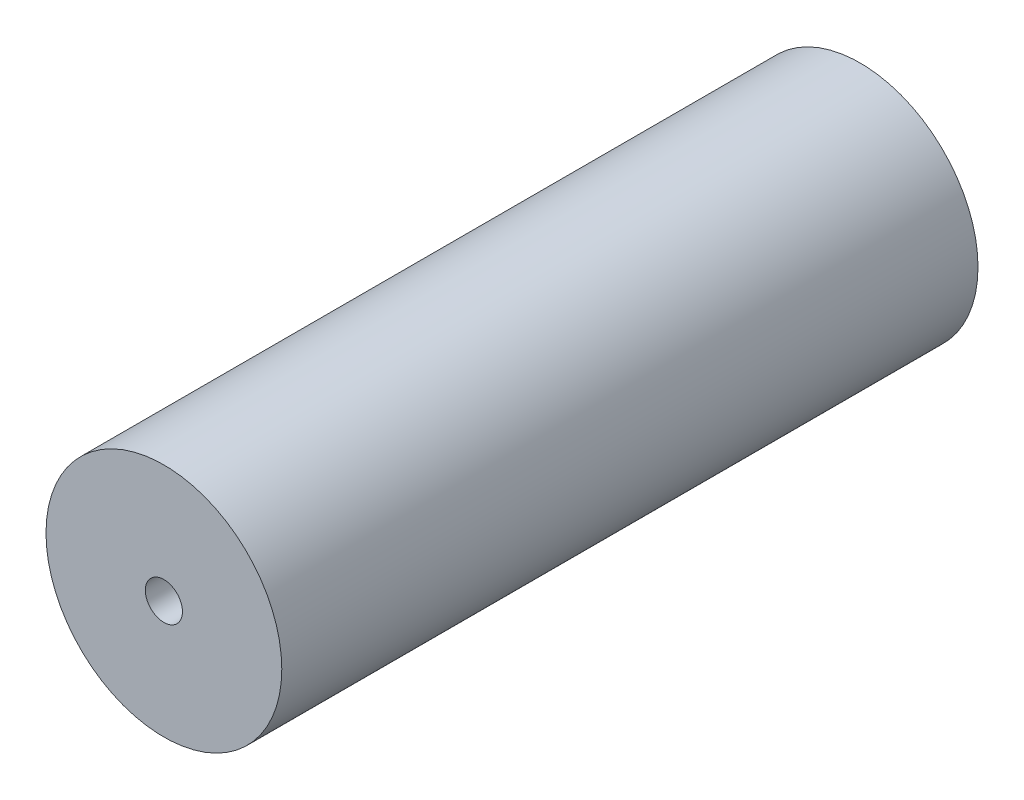
ISO-10303-21;
HEADER;
FILE_DESCRIPTION(('STEP AP214'),'2;1');
FILE_NAME('part.step','',(''),(''),'','','');
FILE_SCHEMA(('AUTOMOTIVE_DESIGN { 1 0 10303 214 1 1 1 1 }'));
ENDSEC;
DATA;
#1=APPLICATION_CONTEXT('core data for automotive mechanical design processes');
#2=APPLICATION_PROTOCOL_DEFINITION('international standard','automotive_design',2000,#1);
#3=PRODUCT_CONTEXT('',#1,'mechanical');
#4=PRODUCT('Part','Part','',(#3));
#5=PRODUCT_RELATED_PRODUCT_CATEGORY('part','',(#4));
#6=PRODUCT_DEFINITION_FORMATION('','',#4);
#7=PRODUCT_DEFINITION_CONTEXT('part definition',#1,'design');
#8=PRODUCT_DEFINITION('design','',#6,#7);
#9=PRODUCT_DEFINITION_SHAPE('','',#8);
#10=(LENGTH_UNIT() NAMED_UNIT(*) SI_UNIT(.MILLI.,.METRE.));
#11=(NAMED_UNIT(*) PLANE_ANGLE_UNIT() SI_UNIT($,.RADIAN.));
#12=(NAMED_UNIT(*) SI_UNIT($,.STERADIAN.) SOLID_ANGLE_UNIT());
#13=UNCERTAINTY_MEASURE_WITH_UNIT(LENGTH_MEASURE(1.E-05),#10,'distance_accuracy_value','');
#14=(GEOMETRIC_REPRESENTATION_CONTEXT(3) GLOBAL_UNCERTAINTY_ASSIGNED_CONTEXT((#13)) GLOBAL_UNIT_ASSIGNED_CONTEXT((#10,
#11,#12)) REPRESENTATION_CONTEXT('',''));
#15=CARTESIAN_POINT('',(0.,0.,0.));
#16=DIRECTION('',(0.,0.,1.));
#17=DIRECTION('',(1.,0.,0.));
#18=AXIS2_PLACEMENT_3D('',#15,#16,#17);
#19=CARTESIAN_POINT('',(0.,0.,150.));
#20=DIRECTION('',(0.,0.,-1.));
#21=DIRECTION('',(-1.,0.,0.));
#22=AXIS2_PLACEMENT_3D('',#19,#20,#21);
#23=CYLINDRICAL_SURFACE('',#22,25.4);
#24=CARTESIAN_POINT('',(0.,0.,150.));
#25=DIRECTION('',(0.,0.,1.));
#26=DIRECTION('',(1.,0.,0.));
#27=AXIS2_PLACEMENT_3D('',#24,#25,#26);
#28=CIRCLE('',#27,25.4);
#29=CARTESIAN_POINT('',(25.4,0.,150.));
#30=VERTEX_POINT('',#29);
#31=EDGE_CURVE('E10',#30,#30,#28,.T.);
#32=ORIENTED_EDGE('',*,*,#31,.F.);
#33=EDGE_LOOP('',(#32));
#34=FACE_BOUND('',#33,.T.);
#35=CARTESIAN_POINT('',(0.,0.,0.));
#36=DIRECTION('',(0.,0.,1.));
#37=DIRECTION('',(1.,0.,0.));
#38=AXIS2_PLACEMENT_3D('',#35,#36,#37);
#39=CIRCLE('',#38,25.4);
#40=CARTESIAN_POINT('',(25.4,0.,0.));
#41=VERTEX_POINT('',#40);
#42=EDGE_CURVE('E39',#41,#41,#39,.T.);
#43=ORIENTED_EDGE('',*,*,#42,.T.);
#44=EDGE_LOOP('',(#43));
#45=FACE_BOUND('',#44,.T.);
#46=ADVANCED_FACE('F36',(#34,#45),#23,.T.);
#47=CARTESIAN_POINT('',(0.,0.,150.));
#48=DIRECTION('',(0.,0.,1.));
#49=DIRECTION('',(1.,0.,0.));
#50=AXIS2_PLACEMENT_3D('',#47,#48,#49);
#51=PLANE('',#50);
#52=CARTESIAN_POINT('',(0.,0.,150.));
#53=DIRECTION('',(0.,0.,1.));
#54=DIRECTION('',(1.,0.,0.));
#55=AXIS2_PLACEMENT_3D('',#52,#53,#54);
#56=CIRCLE('',#55,4.);
#57=CARTESIAN_POINT('',(4.,0.,150.));
#58=VERTEX_POINT('',#57);
#59=EDGE_CURVE('E50',#58,#58,#56,.T.);
#60=ORIENTED_EDGE('',*,*,#59,.F.);
#61=EDGE_LOOP('',(#60));
#62=FACE_BOUND('',#61,.T.);
#63=ORIENTED_EDGE('',*,*,#31,.T.);
#64=EDGE_LOOP('',(#63));
#65=FACE_BOUND('',#64,.T.);
#66=ADVANCED_FACE('F67',(#62,#65),#51,.T.);
#67=CARTESIAN_POINT('',(0.,0.,0.));
#68=DIRECTION('',(0.,0.,1.));
#69=DIRECTION('',(1.,0.,0.));
#70=AXIS2_PLACEMENT_3D('',#67,#68,#69);
#71=PLANE('',#70);
#72=ORIENTED_EDGE('',*,*,#42,.F.);
#73=EDGE_LOOP('',(#72));
#74=FACE_BOUND('',#73,.T.);
#75=ADVANCED_FACE('F63',(#74),#71,.F.);
#76=CARTESIAN_POINT('',(0.,0.,125.));
#77=DIRECTION('',(0.,0.,1.));
#78=DIRECTION('',(1.,0.,0.));
#79=AXIS2_PLACEMENT_3D('',#76,#77,#78);
#80=CYLINDRICAL_SURFACE('',#79,4.);
#81=CARTESIAN_POINT('',(0.,0.,125.));
#82=DIRECTION('',(0.,0.,1.));
#83=DIRECTION('',(1.,0.,0.));
#84=AXIS2_PLACEMENT_3D('',#81,#82,#83);
#85=CIRCLE('',#84,4.);
#86=CARTESIAN_POINT('',(4.,0.,125.));
#87=VERTEX_POINT('',#86);
#88=EDGE_CURVE('E48',#87,#87,#85,.T.);
#89=ORIENTED_EDGE('',*,*,#88,.F.);
#90=EDGE_LOOP('',(#89));
#91=FACE_BOUND('',#90,.T.);
#92=ORIENTED_EDGE('',*,*,#59,.T.);
#93=EDGE_LOOP('',(#92));
#94=FACE_BOUND('',#93,.T.);
#95=ADVANCED_FACE('F60',(#91,#94),#80,.F.);
#96=CARTESIAN_POINT('',(0.,0.,125.));
#97=DIRECTION('',(0.,0.,1.));
#98=DIRECTION('',(1.,0.,0.));
#99=AXIS2_PLACEMENT_3D('',#96,#97,#98);
#100=PLANE('',#99);
#101=ORIENTED_EDGE('',*,*,#88,.T.);
#102=EDGE_LOOP('',(#101));
#103=FACE_BOUND('',#102,.T.);
#104=ADVANCED_FACE('F58',(#103),#100,.T.);
#105=CLOSED_SHELL('',(#46,#66,#75,#95,#104));
#106=MANIFOLD_SOLID_BREP('B2',#105);
#107=ADVANCED_BREP_SHAPE_REPRESENTATION('',(#18,#106),#14);
#108=SHAPE_DEFINITION_REPRESENTATION(#9,#107);
ENDSEC;
END-ISO-10303-21;
